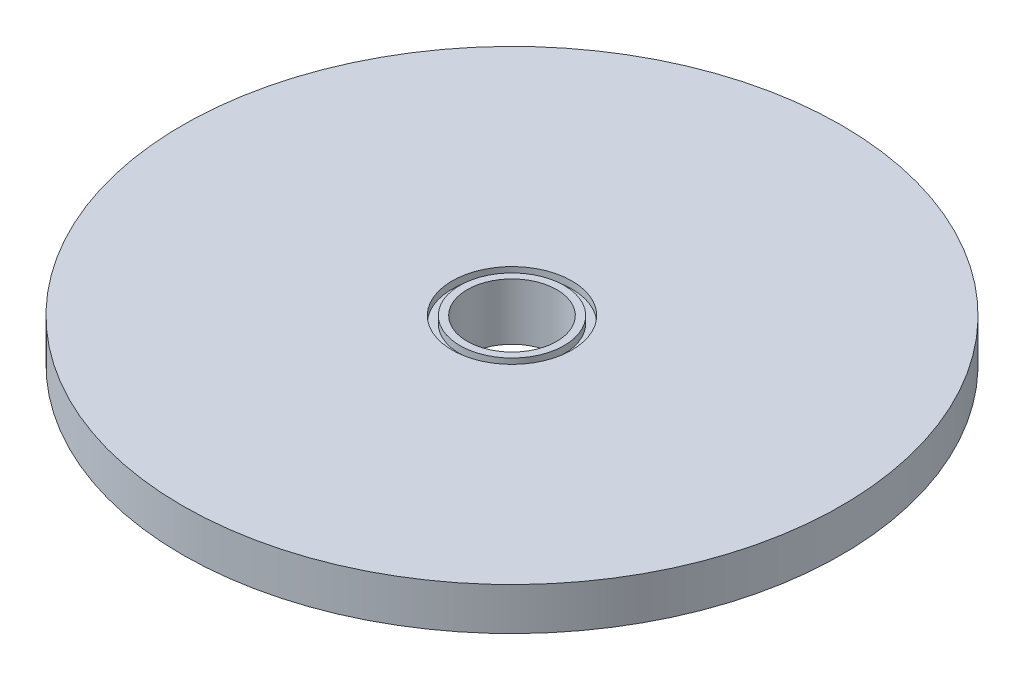
ISO-10303-21;
HEADER;
FILE_DESCRIPTION(('STEP AP214'),'2;1');
FILE_NAME('part.step','',(''),(''),'','','');
FILE_SCHEMA(('AUTOMOTIVE_DESIGN { 1 0 10303 214 1 1 1 1 }'));
ENDSEC;
DATA;
#1=APPLICATION_CONTEXT('core data for automotive mechanical design processes');
#2=APPLICATION_PROTOCOL_DEFINITION('international standard','automotive_design',2000,#1);
#3=PRODUCT_CONTEXT('',#1,'mechanical');
#4=PRODUCT('Part','Part','',(#3));
#5=PRODUCT_RELATED_PRODUCT_CATEGORY('part','',(#4));
#6=PRODUCT_DEFINITION_FORMATION('','',#4);
#7=PRODUCT_DEFINITION_CONTEXT('part definition',#1,'design');
#8=PRODUCT_DEFINITION('design','',#6,#7);
#9=PRODUCT_DEFINITION_SHAPE('','',#8);
#10=(LENGTH_UNIT() NAMED_UNIT(*) SI_UNIT(.MILLI.,.METRE.));
#11=(NAMED_UNIT(*) PLANE_ANGLE_UNIT() SI_UNIT($,.RADIAN.));
#12=(NAMED_UNIT(*) SI_UNIT($,.STERADIAN.) SOLID_ANGLE_UNIT());
#13=UNCERTAINTY_MEASURE_WITH_UNIT(LENGTH_MEASURE(1.E-05),#10,'distance_accuracy_value','');
#14=(GEOMETRIC_REPRESENTATION_CONTEXT(3) GLOBAL_UNCERTAINTY_ASSIGNED_CONTEXT((#13)) GLOBAL_UNIT_ASSIGNED_CONTEXT((#10,
#11,#12)) REPRESENTATION_CONTEXT('',''));
#15=CARTESIAN_POINT('',(0.,0.,0.));
#16=DIRECTION('',(0.,0.,1.));
#17=DIRECTION('',(1.,0.,0.));
#18=AXIS2_PLACEMENT_3D('',#15,#16,#17);
#19=CARTESIAN_POINT('',(0.,12.,0.));
#20=DIRECTION('',(0.,1.,0.));
#21=DIRECTION('',(0.,0.,1.));
#22=AXIS2_PLACEMENT_3D('',#19,#20,#21);
#23=PLANE('',#22);
#24=CARTESIAN_POINT('',(0.,12.,0.));
#25=DIRECTION('',(0.,-1.,0.));
#26=DIRECTION('',(0.,0.,-1.));
#27=AXIS2_PLACEMENT_3D('',#24,#25,#26);
#28=CIRCLE('',#27,9.4967);
#29=CARTESIAN_POINT('',(0.,12.,-9.4967));
#30=VERTEX_POINT('',#29);
#31=EDGE_CURVE('E68',#30,#30,#28,.T.);
#32=ORIENTED_EDGE('',*,*,#31,.T.);
#33=EDGE_LOOP('',(#32));
#34=FACE_BOUND('',#33,.T.);
#35=CARTESIAN_POINT('',(0.,12.,0.));
#36=DIRECTION('',(0.,-1.,0.));
#37=DIRECTION('',(0.,0.,-1.));
#38=AXIS2_PLACEMENT_3D('',#35,#36,#37);
#39=CIRCLE('',#38,11.049);
#40=CARTESIAN_POINT('',(0.,12.,-11.049));
#41=VERTEX_POINT('',#40);
#42=EDGE_CURVE('E10',#41,#41,#39,.T.);
#43=ORIENTED_EDGE('',*,*,#42,.F.);
#44=EDGE_LOOP('',(#43));
#45=FACE_BOUND('',#44,.T.);
#46=ADVANCED_FACE('F33',(#34,#45),#23,.T.);
#47=CARTESIAN_POINT('',(0.,0.,0.));
#48=DIRECTION('',(0.,-1.,0.));
#49=DIRECTION('',(0.,0.,-1.));
#50=AXIS2_PLACEMENT_3D('',#47,#48,#49);
#51=CYLINDRICAL_SURFACE('',#50,11.049);
#52=CARTESIAN_POINT('',(0.,10.5,0.));
#53=DIRECTION('',(0.,-1.,0.));
#54=DIRECTION('',(0.,0.,-1.));
#55=AXIS2_PLACEMENT_3D('',#52,#53,#54);
#56=CIRCLE('',#55,11.049);
#57=CARTESIAN_POINT('',(0.,10.5,-11.049));
#58=VERTEX_POINT('',#57);
#59=EDGE_CURVE('E40',#58,#58,#56,.T.);
#60=ORIENTED_EDGE('',*,*,#59,.F.);
#61=EDGE_LOOP('',(#60));
#62=FACE_BOUND('',#61,.T.);
#63=ORIENTED_EDGE('',*,*,#42,.T.);
#64=EDGE_LOOP('',(#63));
#65=FACE_BOUND('',#64,.T.);
#66=ADVANCED_FACE('F35',(#62,#65),#51,.T.);
#67=CARTESIAN_POINT('',(0.,10.5,0.));
#68=DIRECTION('',(0.,1.,0.));
#69=DIRECTION('',(0.,0.,1.));
#70=AXIS2_PLACEMENT_3D('',#67,#68,#69);
#71=PLANE('',#70);
#72=ORIENTED_EDGE('',*,*,#59,.T.);
#73=EDGE_LOOP('',(#72));
#74=FACE_BOUND('',#73,.T.);
#75=CARTESIAN_POINT('',(0.,10.5,0.));
#76=DIRECTION('',(0.,-1.,0.));
#77=DIRECTION('',(0.,0.,-1.));
#78=AXIS2_PLACEMENT_3D('',#75,#76,#77);
#79=CIRCLE('',#78,12.7);
#80=CARTESIAN_POINT('',(0.,10.5,-12.7));
#81=VERTEX_POINT('',#80);
#82=EDGE_CURVE('E44',#81,#81,#79,.T.);
#83=ORIENTED_EDGE('',*,*,#82,.F.);
#84=EDGE_LOOP('',(#83));
#85=FACE_BOUND('',#84,.T.);
#86=ADVANCED_FACE('F91',(#74,#85),#71,.T.);
#87=CARTESIAN_POINT('',(0.,0.,0.));
#88=DIRECTION('',(0.,-1.,0.));
#89=DIRECTION('',(0.,0.,-1.));
#90=AXIS2_PLACEMENT_3D('',#87,#88,#89);
#91=CYLINDRICAL_SURFACE('',#90,12.7);
#92=ORIENTED_EDGE('',*,*,#82,.T.);
#93=EDGE_LOOP('',(#92));
#94=FACE_BOUND('',#93,.T.);
#95=CARTESIAN_POINT('',(0.,12.,0.));
#96=DIRECTION('',(0.,-1.,0.));
#97=DIRECTION('',(0.,0.,-1.));
#98=AXIS2_PLACEMENT_3D('',#95,#96,#97);
#99=CIRCLE('',#98,12.7);
#100=CARTESIAN_POINT('',(0.,12.,-12.7));
#101=VERTEX_POINT('',#100);
#102=EDGE_CURVE('E48',#101,#101,#99,.T.);
#103=ORIENTED_EDGE('',*,*,#102,.F.);
#104=EDGE_LOOP('',(#103));
#105=FACE_BOUND('',#104,.T.);
#106=ADVANCED_FACE('F97',(#94,#105),#91,.F.);
#107=ORIENTED_EDGE('',*,*,#102,.T.);
#108=EDGE_LOOP('',(#107));
#109=FACE_BOUND('',#108,.T.);
#110=CARTESIAN_POINT('',(0.,12.,0.));
#111=DIRECTION('',(0.,-1.,0.));
#112=DIRECTION('',(0.,0.,-1.));
#113=AXIS2_PLACEMENT_3D('',#110,#111,#112);
#114=CIRCLE('',#113,69.85);
#115=CARTESIAN_POINT('',(0.,12.,-69.85));
#116=VERTEX_POINT('',#115);
#117=EDGE_CURVE('E53',#116,#116,#114,.T.);
#118=ORIENTED_EDGE('',*,*,#117,.F.);
#119=EDGE_LOOP('',(#118));
#120=FACE_BOUND('',#119,.T.);
#121=ADVANCED_FACE('F87',(#109,#120),#23,.T.);
#122=CARTESIAN_POINT('',(0.,0.,0.));
#123=DIRECTION('',(0.,-1.,0.));
#124=DIRECTION('',(0.,0.,-1.));
#125=AXIS2_PLACEMENT_3D('',#122,#123,#124);
#126=CYLINDRICAL_SURFACE('',#125,69.85);
#127=ORIENTED_EDGE('',*,*,#117,.T.);
#128=EDGE_LOOP('',(#127));
#129=FACE_BOUND('',#128,.T.);
#130=CARTESIAN_POINT('',(0.,2.99999999999999,0.));
#131=DIRECTION('',(0.,-1.,0.));
#132=DIRECTION('',(0.,0.,-1.));
#133=AXIS2_PLACEMENT_3D('',#130,#131,#132);
#134=CIRCLE('',#133,69.85);
#135=CARTESIAN_POINT('',(0.,2.99999999999999,-69.85));
#136=VERTEX_POINT('',#135);
#137=EDGE_CURVE('E56',#136,#136,#134,.T.);
#138=ORIENTED_EDGE('',*,*,#137,.F.);
#139=EDGE_LOOP('',(#138));
#140=FACE_BOUND('',#139,.T.);
#141=ADVANCED_FACE('F96',(#129,#140),#126,.T.);
#142=CARTESIAN_POINT('',(0.,2.99999999999999,0.));
#143=DIRECTION('',(0.,-1.,0.));
#144=DIRECTION('',(0.,0.,-1.));
#145=AXIS2_PLACEMENT_3D('',#142,#143,#144);
#146=PLANE('',#145);
#147=ORIENTED_EDGE('',*,*,#137,.T.);
#148=EDGE_LOOP('',(#147));
#149=FACE_BOUND('',#148,.T.);
#150=CARTESIAN_POINT('',(0.,3.,0.));
#151=DIRECTION('',(0.,-1.,0.));
#152=DIRECTION('',(0.,0.,-1.));
#153=AXIS2_PLACEMENT_3D('',#150,#151,#152);
#154=CIRCLE('',#153,47.57);
#155=CARTESIAN_POINT('',(0.,3.,-47.57));
#156=VERTEX_POINT('',#155);
#157=EDGE_CURVE('E59',#156,#156,#154,.T.);
#158=ORIENTED_EDGE('',*,*,#157,.F.);
#159=EDGE_LOOP('',(#158));
#160=FACE_BOUND('',#159,.T.);
#161=ADVANCED_FACE('F103',(#149,#160),#146,.T.);
#162=CARTESIAN_POINT('',(0.,0.,0.));
#163=DIRECTION('',(0.,-1.,0.));
#164=DIRECTION('',(0.,0.,-1.));
#165=AXIS2_PLACEMENT_3D('',#162,#163,#164);
#166=CYLINDRICAL_SURFACE('',#165,47.57);
#167=ORIENTED_EDGE('',*,*,#157,.T.);
#168=EDGE_LOOP('',(#167));
#169=FACE_BOUND('',#168,.T.);
#170=CARTESIAN_POINT('',(0.,0.,0.));
#171=DIRECTION('',(0.,-1.,0.));
#172=DIRECTION('',(0.,0.,-1.));
#173=AXIS2_PLACEMENT_3D('',#170,#171,#172);
#174=CIRCLE('',#173,47.57);
#175=CARTESIAN_POINT('',(0.,0.,-47.57));
#176=VERTEX_POINT('',#175);
#177=EDGE_CURVE('E62',#176,#176,#174,.T.);
#178=ORIENTED_EDGE('',*,*,#177,.F.);
#179=EDGE_LOOP('',(#178));
#180=FACE_BOUND('',#179,.T.);
#181=ADVANCED_FACE('F82',(#169,#180),#166,.T.);
#182=CARTESIAN_POINT('',(0.,0.,0.));
#183=DIRECTION('',(0.,-1.,0.));
#184=DIRECTION('',(0.,0.,-1.));
#185=AXIS2_PLACEMENT_3D('',#182,#183,#184);
#186=PLANE('',#185);
#187=ORIENTED_EDGE('',*,*,#177,.T.);
#188=EDGE_LOOP('',(#187));
#189=FACE_BOUND('',#188,.T.);
#190=CARTESIAN_POINT('',(0.,0.,0.));
#191=DIRECTION('',(0.,-1.,0.));
#192=DIRECTION('',(0.,0.,-1.));
#193=AXIS2_PLACEMENT_3D('',#190,#191,#192);
#194=CIRCLE('',#193,9.4967);
#195=CARTESIAN_POINT('',(0.,0.,-9.4967));
#196=VERTEX_POINT('',#195);
#197=EDGE_CURVE('E65',#196,#196,#194,.T.);
#198=ORIENTED_EDGE('',*,*,#197,.F.);
#199=EDGE_LOOP('',(#198));
#200=FACE_BOUND('',#199,.T.);
#201=ADVANCED_FACE('F76',(#189,#200),#186,.T.);
#202=CARTESIAN_POINT('',(0.,0.,0.));
#203=DIRECTION('',(0.,-1.,0.));
#204=DIRECTION('',(0.,0.,-1.));
#205=AXIS2_PLACEMENT_3D('',#202,#203,#204);
#206=CYLINDRICAL_SURFACE('',#205,9.4967);
#207=ORIENTED_EDGE('',*,*,#197,.T.);
#208=EDGE_LOOP('',(#207));
#209=FACE_BOUND('',#208,.T.);
#210=ORIENTED_EDGE('',*,*,#31,.F.);
#211=EDGE_LOOP('',(#210));
#212=FACE_BOUND('',#211,.T.);
#213=ADVANCED_FACE('F74',(#209,#212),#206,.F.);
#214=CLOSED_SHELL('',(#46,#66,#86,#106,#121,#141,#161,#181,#201,#213));
#215=MANIFOLD_SOLID_BREP('B2',#214);
#216=ADVANCED_BREP_SHAPE_REPRESENTATION('',(#18,#215),#14);
#217=SHAPE_DEFINITION_REPRESENTATION(#9,#216);
ENDSEC;
END-ISO-10303-21;
